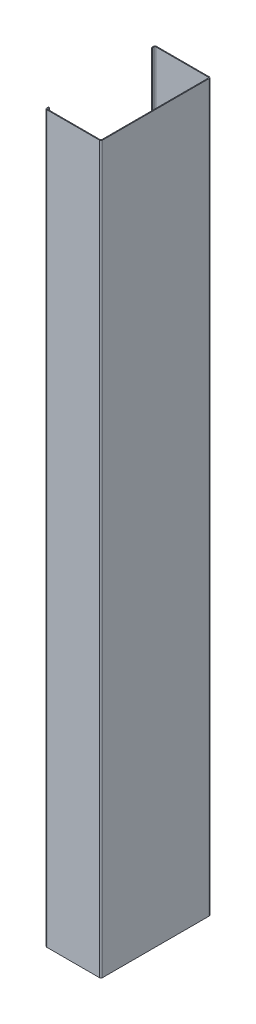
ISO-10303-21;
HEADER;
FILE_DESCRIPTION(('STEP AP214'),'2;1');
FILE_NAME('part.step','',(''),(''),'','','');
FILE_SCHEMA(('AUTOMOTIVE_DESIGN { 1 0 10303 214 1 1 1 1 }'));
ENDSEC;
DATA;
#1=APPLICATION_CONTEXT('core data for automotive mechanical design processes');
#2=APPLICATION_PROTOCOL_DEFINITION('international standard','automotive_design',2000,#1);
#3=PRODUCT_CONTEXT('',#1,'mechanical');
#4=PRODUCT('Part','Part','',(#3));
#5=PRODUCT_RELATED_PRODUCT_CATEGORY('part','',(#4));
#6=PRODUCT_DEFINITION_FORMATION('','',#4);
#7=PRODUCT_DEFINITION_CONTEXT('part definition',#1,'design');
#8=PRODUCT_DEFINITION('design','',#6,#7);
#9=PRODUCT_DEFINITION_SHAPE('','',#8);
#10=(LENGTH_UNIT() NAMED_UNIT(*) SI_UNIT(.MILLI.,.METRE.));
#11=(NAMED_UNIT(*) PLANE_ANGLE_UNIT() SI_UNIT($,.RADIAN.));
#12=(NAMED_UNIT(*) SI_UNIT($,.STERADIAN.) SOLID_ANGLE_UNIT());
#13=UNCERTAINTY_MEASURE_WITH_UNIT(LENGTH_MEASURE(1.E-05),#10,'distance_accuracy_value','');
#14=(GEOMETRIC_REPRESENTATION_CONTEXT(3) GLOBAL_UNCERTAINTY_ASSIGNED_CONTEXT((#13)) GLOBAL_UNIT_ASSIGNED_CONTEXT((#10,
#11,#12)) REPRESENTATION_CONTEXT('',''));
#15=CARTESIAN_POINT('',(0.,0.,0.));
#16=DIRECTION('',(0.,0.,1.));
#17=DIRECTION('',(1.,0.,0.));
#18=AXIS2_PLACEMENT_3D('',#15,#16,#17);
#19=CARTESIAN_POINT('',(-50.,3000.,-49.25));
#20=DIRECTION('',(1.,0.,0.));
#21=DIRECTION('',(0.,0.,-1.));
#22=AXIS2_PLACEMENT_3D('',#19,#20,#21);
#23=PLANE('',#22);
#24=DIRECTION('',(0.,0.,-1.));
#25=VECTOR('',#24,1.);
#26=CARTESIAN_POINT('',(-50.,650.75,49.25));
#27=LINE('',#26,#25);
#28=CARTESIAN_POINT('',(-50.,650.75,-46.25));
#29=VERTEX_POINT('',#28);
#30=CARTESIAN_POINT('',(-50.,650.75,-47.75));
#31=VERTEX_POINT('',#30);
#32=EDGE_CURVE('E183',#29,#31,#27,.T.);
#33=ORIENTED_EDGE('',*,*,#32,.T.);
#34=DIRECTION('',(0.,-1.,0.));
#35=VECTOR('',#34,1.);
#36=CARTESIAN_POINT('',(-50.,3000.,-47.75));
#37=LINE('',#36,#35);
#38=CARTESIAN_POINT('',(-50.,0.,-47.75));
#39=VERTEX_POINT('',#38);
#40=EDGE_CURVE('E58',#31,#39,#37,.T.);
#41=ORIENTED_EDGE('',*,*,#40,.T.);
#42=DIRECTION('',(0.,0.,1.));
#43=VECTOR('',#42,1.);
#44=CARTESIAN_POINT('',(-50.,0.,-49.25));
#45=LINE('',#44,#43);
#46=CARTESIAN_POINT('',(-50.,0.,-46.25));
#47=VERTEX_POINT('',#46);
#48=EDGE_CURVE('E235',#39,#47,#45,.T.);
#49=ORIENTED_EDGE('',*,*,#48,.T.);
#50=DIRECTION('',(0.,-1.,0.));
#51=VECTOR('',#50,1.);
#52=CARTESIAN_POINT('',(-50.,3000.,-46.25));
#53=LINE('',#52,#51);
#54=EDGE_CURVE('E44',#29,#47,#53,.T.);
#55=ORIENTED_EDGE('',*,*,#54,.F.);
#56=EDGE_LOOP('',(#33,#41,#49,#55));
#57=FACE_BOUND('',#56,.T.);
#58=ADVANCED_FACE('F37',(#57),#23,.F.);
#59=CARTESIAN_POINT('',(-49.25,3000.,-46.25));
#60=DIRECTION('',(0.,0.,1.));
#61=DIRECTION('',(1.,0.,0.));
#62=AXIS2_PLACEMENT_3D('',#59,#60,#61);
#63=PLANE('',#62);
#64=DIRECTION('',(0.,-1.,0.));
#65=VECTOR('',#64,1.);
#66=CARTESIAN_POINT('',(-49.25,3000.,-46.25));
#67=LINE('',#66,#65);
#68=CARTESIAN_POINT('',(-49.25,650.75,-46.25));
#69=VERTEX_POINT('',#68);
#70=CARTESIAN_POINT('',(-49.25,0.,-46.25));
#71=VERTEX_POINT('',#70);
#72=EDGE_CURVE('E223',#69,#71,#67,.T.);
#73=ORIENTED_EDGE('',*,*,#72,.F.);
#74=DIRECTION('',(-1.,0.,0.));
#75=VECTOR('',#74,1.);
#76=CARTESIAN_POINT('',(-49.25,650.75,-46.25));
#77=LINE('',#76,#75);
#78=EDGE_CURVE('E233',#69,#29,#77,.T.);
#79=ORIENTED_EDGE('',*,*,#78,.T.);
#80=ORIENTED_EDGE('',*,*,#54,.T.);
#81=DIRECTION('',(-1.,0.,0.));
#82=VECTOR('',#81,1.);
#83=CARTESIAN_POINT('',(-49.25,0.,-46.25));
#84=LINE('',#83,#82);
#85=EDGE_CURVE('E231',#71,#47,#84,.T.);
#86=ORIENTED_EDGE('',*,*,#85,.F.);
#87=EDGE_LOOP('',(#73,#79,#80,#86));
#88=FACE_BOUND('',#87,.T.);
#89=ADVANCED_FACE('F229',(#88),#63,.T.);
#90=CARTESIAN_POINT('',(-49.25,3000.,-49.25));
#91=DIRECTION('',(1.,0.,0.));
#92=DIRECTION('',(0.,0.,-1.));
#93=AXIS2_PLACEMENT_3D('',#90,#91,#92);
#94=PLANE('',#93);
#95=DIRECTION('',(0.,-1.,0.));
#96=VECTOR('',#95,1.);
#97=CARTESIAN_POINT('',(-49.25,3000.,-47.75));
#98=LINE('',#97,#96);
#99=CARTESIAN_POINT('',(-49.25,650.75,-47.75));
#100=VERTEX_POINT('',#99);
#101=CARTESIAN_POINT('',(-49.25,0.,-47.75));
#102=VERTEX_POINT('',#101);
#103=EDGE_CURVE('E221',#100,#102,#98,.T.);
#104=ORIENTED_EDGE('',*,*,#103,.F.);
#105=DIRECTION('',(0.,0.,1.));
#106=VECTOR('',#105,1.);
#107=CARTESIAN_POINT('',(-49.25,650.75,-49.25));
#108=LINE('',#107,#106);
#109=EDGE_CURVE('E351',#100,#69,#108,.T.);
#110=ORIENTED_EDGE('',*,*,#109,.T.);
#111=ORIENTED_EDGE('',*,*,#72,.T.);
#112=DIRECTION('',(0.,0.,-1.));
#113=VECTOR('',#112,1.);
#114=CARTESIAN_POINT('',(-49.25,0.,-49.25));
#115=LINE('',#114,#113);
#116=EDGE_CURVE('E243',#102,#71,#115,.F.);
#117=ORIENTED_EDGE('',*,*,#116,.F.);
#118=EDGE_LOOP('',(#104,#110,#111,#117));
#119=FACE_BOUND('',#118,.T.);
#120=ADVANCED_FACE('F355',(#119),#94,.T.);
#121=CARTESIAN_POINT('',(-48.5,3000.,-47.75));
#122=DIRECTION('',(0.,-1.,0.));
#123=DIRECTION('',(0.,0.,-1.));
#124=AXIS2_PLACEMENT_3D('',#121,#122,#123);
#125=CYLINDRICAL_SURFACE('',#124,0.75);
#126=DIRECTION('',(0.,-1.,0.));
#127=VECTOR('',#126,1.);
#128=CARTESIAN_POINT('',(-48.5,3000.,-48.5));
#129=LINE('',#128,#127);
#130=CARTESIAN_POINT('',(-48.5,650.75,-48.5));
#131=VERTEX_POINT('',#130);
#132=CARTESIAN_POINT('',(-48.5,0.,-48.5));
#133=VERTEX_POINT('',#132);
#134=EDGE_CURVE('E219',#131,#133,#129,.T.);
#135=ORIENTED_EDGE('',*,*,#134,.F.);
#136=CARTESIAN_POINT('',(-48.5,650.75,-47.75));
#137=DIRECTION('',(0.,1.,0.));
#138=DIRECTION('',(0.,0.,1.));
#139=AXIS2_PLACEMENT_3D('',#136,#137,#138);
#140=CIRCLE('',#139,0.75);
#141=EDGE_CURVE('E348',#131,#100,#140,.T.);
#142=ORIENTED_EDGE('',*,*,#141,.T.);
#143=ORIENTED_EDGE('',*,*,#103,.T.);
#144=CARTESIAN_POINT('',(-48.5,0.,-47.75));
#145=DIRECTION('',(0.,1.,0.));
#146=DIRECTION('',(1.,0.,0.));
#147=AXIS2_PLACEMENT_3D('',#144,#145,#146);
#148=CIRCLE('',#147,0.75);
#149=EDGE_CURVE('E245',#133,#102,#148,.T.);
#150=ORIENTED_EDGE('',*,*,#149,.F.);
#151=EDGE_LOOP('',(#135,#142,#143,#150));
#152=FACE_BOUND('',#151,.T.);
#153=ADVANCED_FACE('F358',(#152),#125,.F.);
#154=CARTESIAN_POINT('',(-50.,3000.,-48.5));
#155=DIRECTION('',(0.,0.,1.));
#156=DIRECTION('',(1.,0.,0.));
#157=AXIS2_PLACEMENT_3D('',#154,#155,#156);
#158=PLANE('',#157);
#159=DIRECTION('',(0.,-1.,0.));
#160=VECTOR('',#159,1.);
#161=CARTESIAN_POINT('',(-1.50000000000004,3000.,-48.5));
#162=LINE('',#161,#160);
#163=CARTESIAN_POINT('',(-1.50000000000004,650.75,-48.5));
#164=VERTEX_POINT('',#163);
#165=CARTESIAN_POINT('',(-1.50000000000004,0.,-48.5));
#166=VERTEX_POINT('',#165);
#167=EDGE_CURVE('E217',#164,#166,#162,.T.);
#168=ORIENTED_EDGE('',*,*,#167,.F.);
#169=DIRECTION('',(-1.,0.,0.));
#170=VECTOR('',#169,1.);
#171=CARTESIAN_POINT('',(-50.,650.75,-48.5));
#172=LINE('',#171,#170);
#173=EDGE_CURVE('E345',#164,#131,#172,.T.);
#174=ORIENTED_EDGE('',*,*,#173,.T.);
#175=ORIENTED_EDGE('',*,*,#134,.T.);
#176=DIRECTION('',(1.,0.,0.));
#177=VECTOR('',#176,1.);
#178=CARTESIAN_POINT('',(-50.,0.,-48.5));
#179=LINE('',#178,#177);
#180=EDGE_CURVE('E250',#166,#133,#179,.F.);
#181=ORIENTED_EDGE('',*,*,#180,.F.);
#182=EDGE_LOOP('',(#168,#174,#175,#181));
#183=FACE_BOUND('',#182,.T.);
#184=ADVANCED_FACE('F363',(#183),#158,.T.);
#185=CARTESIAN_POINT('',(-1.50000000000004,3000.,-47.75));
#186=DIRECTION('',(0.,-1.,0.));
#187=DIRECTION('',(0.,0.,-1.));
#188=AXIS2_PLACEMENT_3D('',#185,#186,#187);
#189=CYLINDRICAL_SURFACE('',#188,0.75);
#190=DIRECTION('',(0.,-1.,0.));
#191=VECTOR('',#190,1.);
#192=CARTESIAN_POINT('',(-0.750000000000037,3000.,-47.75));
#193=LINE('',#192,#191);
#194=CARTESIAN_POINT('',(-0.750000000000037,650.75,-47.75));
#195=VERTEX_POINT('',#194);
#196=CARTESIAN_POINT('',(-0.750000000000037,0.,-47.75));
#197=VERTEX_POINT('',#196);
#198=EDGE_CURVE('E215',#195,#197,#193,.T.);
#199=ORIENTED_EDGE('',*,*,#198,.F.);
#200=CARTESIAN_POINT('',(-1.50000000000004,650.75,-47.75));
#201=DIRECTION('',(0.,1.,0.));
#202=DIRECTION('',(0.,0.,1.));
#203=AXIS2_PLACEMENT_3D('',#200,#201,#202);
#204=CIRCLE('',#203,0.75);
#205=EDGE_CURVE('E342',#195,#164,#204,.T.);
#206=ORIENTED_EDGE('',*,*,#205,.T.);
#207=ORIENTED_EDGE('',*,*,#167,.T.);
#208=CARTESIAN_POINT('',(-1.50000000000004,0.,-47.75));
#209=DIRECTION('',(0.,1.,0.));
#210=DIRECTION('',(1.,0.,0.));
#211=AXIS2_PLACEMENT_3D('',#208,#209,#210);
#212=CIRCLE('',#211,0.75);
#213=EDGE_CURVE('E253',#197,#166,#212,.T.);
#214=ORIENTED_EDGE('',*,*,#213,.F.);
#215=EDGE_LOOP('',(#199,#206,#207,#214));
#216=FACE_BOUND('',#215,.T.);
#217=ADVANCED_FACE('F366',(#216),#189,.F.);
#218=CARTESIAN_POINT('',(-0.750000000000038,3000.,-49.25));
#219=DIRECTION('',(-1.,0.,0.));
#220=DIRECTION('',(0.,0.,1.));
#221=AXIS2_PLACEMENT_3D('',#218,#219,#220);
#222=PLANE('',#221);
#223=DIRECTION('',(0.,-1.,0.));
#224=VECTOR('',#223,1.);
#225=CARTESIAN_POINT('',(-0.749999999999984,3000.,47.75));
#226=LINE('',#225,#224);
#227=CARTESIAN_POINT('',(-0.749999999999984,650.75,47.75));
#228=VERTEX_POINT('',#227);
#229=CARTESIAN_POINT('',(-0.749999999999984,0.,47.75));
#230=VERTEX_POINT('',#229);
#231=EDGE_CURVE('E213',#228,#230,#226,.T.);
#232=ORIENTED_EDGE('',*,*,#231,.F.);
#233=DIRECTION('',(0.,0.,-1.));
#234=VECTOR('',#233,1.);
#235=CARTESIAN_POINT('',(-0.750000000000038,650.75,-49.25));
#236=LINE('',#235,#234);
#237=EDGE_CURVE('E339',#228,#195,#236,.T.);
#238=ORIENTED_EDGE('',*,*,#237,.T.);
#239=ORIENTED_EDGE('',*,*,#198,.T.);
#240=DIRECTION('',(0.,0.,-1.));
#241=VECTOR('',#240,1.);
#242=CARTESIAN_POINT('',(-0.750000000000038,0.,-49.25));
#243=LINE('',#242,#241);
#244=EDGE_CURVE('E256',#230,#197,#243,.T.);
#245=ORIENTED_EDGE('',*,*,#244,.F.);
#246=EDGE_LOOP('',(#232,#238,#239,#245));
#247=FACE_BOUND('',#246,.T.);
#248=ADVANCED_FACE('F371',(#247),#222,.T.);
#249=CARTESIAN_POINT('',(-1.49999999999998,3000.,47.75));
#250=DIRECTION('',(0.,-1.,0.));
#251=DIRECTION('',(0.,0.,-1.));
#252=AXIS2_PLACEMENT_3D('',#249,#250,#251);
#253=CYLINDRICAL_SURFACE('',#252,0.75);
#254=DIRECTION('',(0.,-1.,0.));
#255=VECTOR('',#254,1.);
#256=CARTESIAN_POINT('',(-1.49999999999998,3000.,48.5));
#257=LINE('',#256,#255);
#258=CARTESIAN_POINT('',(-1.49999999999998,650.75,48.5));
#259=VERTEX_POINT('',#258);
#260=CARTESIAN_POINT('',(-1.49999999999998,0.,48.5));
#261=VERTEX_POINT('',#260);
#262=EDGE_CURVE('E211',#259,#261,#257,.T.);
#263=ORIENTED_EDGE('',*,*,#262,.F.);
#264=CARTESIAN_POINT('',(-1.49999999999998,650.75,47.75));
#265=DIRECTION('',(0.,1.,0.));
#266=DIRECTION('',(0.,0.,1.));
#267=AXIS2_PLACEMENT_3D('',#264,#265,#266);
#268=CIRCLE('',#267,0.75);
#269=EDGE_CURVE('E336',#259,#228,#268,.T.);
#270=ORIENTED_EDGE('',*,*,#269,.T.);
#271=ORIENTED_EDGE('',*,*,#231,.T.);
#272=CARTESIAN_POINT('',(-1.49999999999998,0.,47.75));
#273=DIRECTION('',(0.,1.,0.));
#274=DIRECTION('',(1.,0.,0.));
#275=AXIS2_PLACEMENT_3D('',#272,#273,#274);
#276=CIRCLE('',#275,0.75);
#277=EDGE_CURVE('E259',#261,#230,#276,.T.);
#278=ORIENTED_EDGE('',*,*,#277,.F.);
#279=EDGE_LOOP('',(#263,#270,#271,#278));
#280=FACE_BOUND('',#279,.T.);
#281=ADVANCED_FACE('F374',(#280),#253,.F.);
#282=CARTESIAN_POINT('',(0.,3000.,48.5));
#283=DIRECTION('',(0.,0.,-1.));
#284=DIRECTION('',(-1.,0.,0.));
#285=AXIS2_PLACEMENT_3D('',#282,#283,#284);
#286=PLANE('',#285);
#287=DIRECTION('',(0.,-1.,0.));
#288=VECTOR('',#287,1.);
#289=CARTESIAN_POINT('',(-48.5,3000.,48.5));
#290=LINE('',#289,#288);
#291=CARTESIAN_POINT('',(-48.5,650.75,48.5));
#292=VERTEX_POINT('',#291);
#293=CARTESIAN_POINT('',(-48.5,0.,48.5));
#294=VERTEX_POINT('',#293);
#295=EDGE_CURVE('E209',#292,#294,#290,.T.);
#296=ORIENTED_EDGE('',*,*,#295,.F.);
#297=DIRECTION('',(1.,0.,0.));
#298=VECTOR('',#297,1.);
#299=CARTESIAN_POINT('',(0.,650.75,48.5));
#300=LINE('',#299,#298);
#301=EDGE_CURVE('E333',#292,#259,#300,.T.);
#302=ORIENTED_EDGE('',*,*,#301,.T.);
#303=ORIENTED_EDGE('',*,*,#262,.T.);
#304=DIRECTION('',(1.,0.,0.));
#305=VECTOR('',#304,1.);
#306=CARTESIAN_POINT('',(0.,0.,48.5));
#307=LINE('',#306,#305);
#308=EDGE_CURVE('E262',#294,#261,#307,.T.);
#309=ORIENTED_EDGE('',*,*,#308,.F.);
#310=EDGE_LOOP('',(#296,#302,#303,#309));
#311=FACE_BOUND('',#310,.T.);
#312=ADVANCED_FACE('F379',(#311),#286,.T.);
#313=CARTESIAN_POINT('',(-48.5,3000.,47.75));
#314=DIRECTION('',(0.,-1.,0.));
#315=DIRECTION('',(0.,0.,-1.));
#316=AXIS2_PLACEMENT_3D('',#313,#314,#315);
#317=CYLINDRICAL_SURFACE('',#316,0.75);
#318=DIRECTION('',(0.,-1.,0.));
#319=VECTOR('',#318,1.);
#320=CARTESIAN_POINT('',(-49.25,3000.,47.75));
#321=LINE('',#320,#319);
#322=CARTESIAN_POINT('',(-49.25,650.75,47.75));
#323=VERTEX_POINT('',#322);
#324=CARTESIAN_POINT('',(-49.25,0.,47.75));
#325=VERTEX_POINT('',#324);
#326=EDGE_CURVE('E207',#323,#325,#321,.T.);
#327=ORIENTED_EDGE('',*,*,#326,.F.);
#328=CARTESIAN_POINT('',(-48.5,650.75,47.75));
#329=DIRECTION('',(0.,1.,0.));
#330=DIRECTION('',(0.,0.,1.));
#331=AXIS2_PLACEMENT_3D('',#328,#329,#330);
#332=CIRCLE('',#331,0.75);
#333=EDGE_CURVE('E330',#323,#292,#332,.T.);
#334=ORIENTED_EDGE('',*,*,#333,.T.);
#335=ORIENTED_EDGE('',*,*,#295,.T.);
#336=CARTESIAN_POINT('',(-48.5,0.,47.75));
#337=DIRECTION('',(0.,1.,0.));
#338=DIRECTION('',(1.,0.,0.));
#339=AXIS2_PLACEMENT_3D('',#336,#337,#338);
#340=CIRCLE('',#339,0.75);
#341=EDGE_CURVE('E265',#325,#294,#340,.T.);
#342=ORIENTED_EDGE('',*,*,#341,.F.);
#343=EDGE_LOOP('',(#327,#334,#335,#342));
#344=FACE_BOUND('',#343,.T.);
#345=ADVANCED_FACE('F382',(#344),#317,.F.);
#346=CARTESIAN_POINT('',(-49.25,3000.,49.25));
#347=DIRECTION('',(1.,0.,0.));
#348=DIRECTION('',(0.,0.,-1.));
#349=AXIS2_PLACEMENT_3D('',#346,#347,#348);
#350=PLANE('',#349);
#351=DIRECTION('',(0.,-1.,0.));
#352=VECTOR('',#351,1.);
#353=CARTESIAN_POINT('',(-49.25,3000.,46.25));
#354=LINE('',#353,#352);
#355=CARTESIAN_POINT('',(-49.25,650.75,46.25));
#356=VERTEX_POINT('',#355);
#357=CARTESIAN_POINT('',(-49.25,0.,46.25));
#358=VERTEX_POINT('',#357);
#359=EDGE_CURVE('E200',#356,#358,#354,.T.);
#360=ORIENTED_EDGE('',*,*,#359,.F.);
#361=DIRECTION('',(0.,0.,1.));
#362=VECTOR('',#361,1.);
#363=CARTESIAN_POINT('',(-49.25,650.75,49.25));
#364=LINE('',#363,#362);
#365=EDGE_CURVE('E327',#356,#323,#364,.T.);
#366=ORIENTED_EDGE('',*,*,#365,.T.);
#367=ORIENTED_EDGE('',*,*,#326,.T.);
#368=DIRECTION('',(0.,0.,-1.));
#369=VECTOR('',#368,1.);
#370=CARTESIAN_POINT('',(-49.25,0.,49.25));
#371=LINE('',#370,#369);
#372=EDGE_CURVE('E268',#358,#325,#371,.F.);
#373=ORIENTED_EDGE('',*,*,#372,.F.);
#374=EDGE_LOOP('',(#360,#366,#367,#373));
#375=FACE_BOUND('',#374,.T.);
#376=ADVANCED_FACE('F387',(#375),#350,.T.);
#377=CARTESIAN_POINT('',(-50.,3000.,46.25));
#378=DIRECTION('',(0.,0.,-1.));
#379=DIRECTION('',(-1.,0.,0.));
#380=AXIS2_PLACEMENT_3D('',#377,#378,#379);
#381=PLANE('',#380);
#382=DIRECTION('',(0.,-1.,0.));
#383=VECTOR('',#382,1.);
#384=CARTESIAN_POINT('',(-50.,3000.,46.25));
#385=LINE('',#384,#383);
#386=CARTESIAN_POINT('',(-50.,650.75,46.25));
#387=VERTEX_POINT('',#386);
#388=CARTESIAN_POINT('',(-50.,0.,46.25));
#389=VERTEX_POINT('',#388);
#390=EDGE_CURVE('E198',#387,#389,#385,.T.);
#391=ORIENTED_EDGE('',*,*,#390,.F.);
#392=DIRECTION('',(1.,0.,0.));
#393=VECTOR('',#392,1.);
#394=CARTESIAN_POINT('',(-50.,650.75,46.25));
#395=LINE('',#394,#393);
#396=EDGE_CURVE('E178',#387,#356,#395,.T.);
#397=ORIENTED_EDGE('',*,*,#396,.T.);
#398=ORIENTED_EDGE('',*,*,#359,.T.);
#399=DIRECTION('',(1.,0.,0.));
#400=VECTOR('',#399,1.);
#401=CARTESIAN_POINT('',(-50.,0.,46.25));
#402=LINE('',#401,#400);
#403=EDGE_CURVE('E270',#389,#358,#402,.T.);
#404=ORIENTED_EDGE('',*,*,#403,.F.);
#405=EDGE_LOOP('',(#391,#397,#398,#404));
#406=FACE_BOUND('',#405,.T.);
#407=ADVANCED_FACE('F389',(#406),#381,.T.);
#408=CARTESIAN_POINT('',(-50.,3000.,49.25));
#409=DIRECTION('',(1.,0.,0.));
#410=DIRECTION('',(0.,0.,-1.));
#411=AXIS2_PLACEMENT_3D('',#408,#409,#410);
#412=PLANE('',#411);
#413=CARTESIAN_POINT('',(-50.,650.75,47.75));
#414=VERTEX_POINT('',#413);
#415=EDGE_CURVE('E172',#414,#387,#27,.T.);
#416=ORIENTED_EDGE('',*,*,#415,.T.);
#417=ORIENTED_EDGE('',*,*,#390,.T.);
#418=DIRECTION('',(0.,0.,1.));
#419=VECTOR('',#418,1.);
#420=CARTESIAN_POINT('',(-50.,0.,49.25));
#421=LINE('',#420,#419);
#422=CARTESIAN_POINT('',(-50.,0.,47.75));
#423=VERTEX_POINT('',#422);
#424=EDGE_CURVE('E196',#389,#423,#421,.T.);
#425=ORIENTED_EDGE('',*,*,#424,.T.);
#426=DIRECTION('',(0.,-1.,0.));
#427=VECTOR('',#426,1.);
#428=CARTESIAN_POINT('',(-50.,3000.,47.75));
#429=LINE('',#428,#427);
#430=EDGE_CURVE('E189',#414,#423,#429,.T.);
#431=ORIENTED_EDGE('',*,*,#430,.F.);
#432=EDGE_LOOP('',(#416,#417,#425,#431));
#433=FACE_BOUND('',#432,.T.);
#434=ADVANCED_FACE('F194',(#433),#412,.F.);
#435=CARTESIAN_POINT('',(-48.5,3000.,47.75));
#436=DIRECTION('',(0.,-1.,0.));
#437=DIRECTION('',(0.,0.,-1.));
#438=AXIS2_PLACEMENT_3D('',#435,#436,#437);
#439=CYLINDRICAL_SURFACE('',#438,1.5);
#440=CARTESIAN_POINT('',(-48.5,650.75,47.75));
#441=DIRECTION('',(0.,1.,0.));
#442=DIRECTION('',(0.,0.,1.));
#443=AXIS2_PLACEMENT_3D('',#440,#441,#442);
#444=CIRCLE('',#443,1.5);
#445=CARTESIAN_POINT('',(-48.5,650.75,49.25));
#446=VERTEX_POINT('',#445);
#447=EDGE_CURVE('E175',#414,#446,#444,.T.);
#448=ORIENTED_EDGE('',*,*,#447,.F.);
#449=ORIENTED_EDGE('',*,*,#430,.T.);
#450=CARTESIAN_POINT('',(-48.5,0.,47.75));
#451=DIRECTION('',(0.,-1.,0.));
#452=DIRECTION('',(0.,0.,-1.));
#453=AXIS2_PLACEMENT_3D('',#450,#451,#452);
#454=CIRCLE('',#453,1.5);
#455=CARTESIAN_POINT('',(-48.5,0.,49.25));
#456=VERTEX_POINT('',#455);
#457=EDGE_CURVE('E274',#423,#456,#454,.F.);
#458=ORIENTED_EDGE('',*,*,#457,.T.);
#459=DIRECTION('',(0.,-1.,0.));
#460=VECTOR('',#459,1.);
#461=CARTESIAN_POINT('',(-48.5,3000.,49.25));
#462=LINE('',#461,#460);
#463=EDGE_CURVE('E191',#446,#456,#462,.T.);
#464=ORIENTED_EDGE('',*,*,#463,.F.);
#465=EDGE_LOOP('',(#448,#449,#458,#464));
#466=FACE_BOUND('',#465,.T.);
#467=ADVANCED_FACE('F187',(#466),#439,.T.);
#468=CARTESIAN_POINT('',(0.,3000.,49.25));
#469=DIRECTION('',(0.,0.,-1.));
#470=DIRECTION('',(-1.,0.,0.));
#471=AXIS2_PLACEMENT_3D('',#468,#469,#470);
#472=PLANE('',#471);
#473=DIRECTION('',(1.,0.,0.));
#474=VECTOR('',#473,1.);
#475=CARTESIAN_POINT('',(0.,650.75,49.25));
#476=LINE('',#475,#474);
#477=CARTESIAN_POINT('',(-1.49999999999998,650.75,49.25));
#478=VERTEX_POINT('',#477);
#479=EDGE_CURVE('E323',#446,#478,#476,.T.);
#480=ORIENTED_EDGE('',*,*,#479,.F.);
#481=ORIENTED_EDGE('',*,*,#463,.T.);
#482=DIRECTION('',(1.,0.,0.));
#483=VECTOR('',#482,1.);
#484=CARTESIAN_POINT('',(0.,0.,49.25));
#485=LINE('',#484,#483);
#486=CARTESIAN_POINT('',(-1.49999999999998,0.,49.25));
#487=VERTEX_POINT('',#486);
#488=EDGE_CURVE('E276',#456,#487,#485,.T.);
#489=ORIENTED_EDGE('',*,*,#488,.T.);
#490=DIRECTION('',(0.,-1.,0.));
#491=VECTOR('',#490,1.);
#492=CARTESIAN_POINT('',(-1.49999999999998,3000.,49.25));
#493=LINE('',#492,#491);
#494=EDGE_CURVE('E202',#478,#487,#493,.T.);
#495=ORIENTED_EDGE('',*,*,#494,.F.);
#496=EDGE_LOOP('',(#480,#481,#489,#495));
#497=FACE_BOUND('',#496,.T.);
#498=ADVANCED_FACE('F310',(#497),#472,.F.);
#499=CARTESIAN_POINT('',(-1.49999999999998,3000.,47.75));
#500=DIRECTION('',(0.,-1.,0.));
#501=DIRECTION('',(0.,0.,-1.));
#502=AXIS2_PLACEMENT_3D('',#499,#500,#501);
#503=CYLINDRICAL_SURFACE('',#502,1.5);
#504=CARTESIAN_POINT('',(-1.49999999999998,650.75,47.75));
#505=DIRECTION('',(0.,1.,0.));
#506=DIRECTION('',(0.,0.,1.));
#507=AXIS2_PLACEMENT_3D('',#504,#505,#506);
#508=CIRCLE('',#507,1.5);
#509=CARTESIAN_POINT('',(0.,650.75,47.75));
#510=VERTEX_POINT('',#509);
#511=EDGE_CURVE('E192',#478,#510,#508,.T.);
#512=ORIENTED_EDGE('',*,*,#511,.F.);
#513=ORIENTED_EDGE('',*,*,#494,.T.);
#514=CARTESIAN_POINT('',(-1.49999999999998,0.,47.75));
#515=DIRECTION('',(0.,-1.,0.));
#516=DIRECTION('',(0.,0.,-1.));
#517=AXIS2_PLACEMENT_3D('',#514,#515,#516);
#518=CIRCLE('',#517,1.5);
#519=CARTESIAN_POINT('',(0.,0.,47.75));
#520=VERTEX_POINT('',#519);
#521=EDGE_CURVE('E279',#487,#520,#518,.F.);
#522=ORIENTED_EDGE('',*,*,#521,.T.);
#523=DIRECTION('',(0.,-1.,0.));
#524=VECTOR('',#523,1.);
#525=CARTESIAN_POINT('',(0.,3000.,47.75));
#526=LINE('',#525,#524);
#527=EDGE_CURVE('E300',#510,#520,#526,.T.);
#528=ORIENTED_EDGE('',*,*,#527,.F.);
#529=EDGE_LOOP('',(#512,#513,#522,#528));
#530=FACE_BOUND('',#529,.T.);
#531=ADVANCED_FACE('F304',(#530),#503,.T.);
#532=CARTESIAN_POINT('',(0.,3000.,-49.25));
#533=DIRECTION('',(-1.,0.,0.));
#534=DIRECTION('',(0.,0.,1.));
#535=AXIS2_PLACEMENT_3D('',#532,#533,#534);
#536=PLANE('',#535);
#537=DIRECTION('',(0.,0.,-1.));
#538=VECTOR('',#537,1.);
#539=CARTESIAN_POINT('',(0.,650.75,49.25));
#540=LINE('',#539,#538);
#541=CARTESIAN_POINT('',(0.,650.75,-47.75));
#542=VERTEX_POINT('',#541);
#543=EDGE_CURVE('E182',#510,#542,#540,.T.);
#544=ORIENTED_EDGE('',*,*,#543,.F.);
#545=ORIENTED_EDGE('',*,*,#527,.T.);
#546=DIRECTION('',(0.,0.,-1.));
#547=VECTOR('',#546,1.);
#548=CARTESIAN_POINT('',(0.,0.,-49.25));
#549=LINE('',#548,#547);
#550=CARTESIAN_POINT('',(0.,0.,-47.75));
#551=VERTEX_POINT('',#550);
#552=EDGE_CURVE('E282',#520,#551,#549,.T.);
#553=ORIENTED_EDGE('',*,*,#552,.T.);
#554=DIRECTION('',(0.,-1.,0.));
#555=VECTOR('',#554,1.);
#556=CARTESIAN_POINT('',(0.,3000.,-47.75));
#557=LINE('',#556,#555);
#558=EDGE_CURVE('E298',#542,#551,#557,.T.);
#559=ORIENTED_EDGE('',*,*,#558,.F.);
#560=EDGE_LOOP('',(#544,#545,#553,#559));
#561=FACE_BOUND('',#560,.T.);
#562=ADVANCED_FACE('F316',(#561),#536,.F.);
#563=CARTESIAN_POINT('',(-1.50000000000004,3000.,-47.75));
#564=DIRECTION('',(0.,-1.,0.));
#565=DIRECTION('',(0.,0.,-1.));
#566=AXIS2_PLACEMENT_3D('',#563,#564,#565);
#567=CYLINDRICAL_SURFACE('',#566,1.5);
#568=CARTESIAN_POINT('',(-1.50000000000004,650.75,-47.75));
#569=DIRECTION('',(0.,1.,0.));
#570=DIRECTION('',(0.,0.,1.));
#571=AXIS2_PLACEMENT_3D('',#568,#569,#570);
#572=CIRCLE('',#571,1.5);
#573=CARTESIAN_POINT('',(-1.50000000000004,650.75,-49.25));
#574=VERTEX_POINT('',#573);
#575=EDGE_CURVE('E318',#542,#574,#572,.T.);
#576=ORIENTED_EDGE('',*,*,#575,.F.);
#577=ORIENTED_EDGE('',*,*,#558,.T.);
#578=CARTESIAN_POINT('',(-1.50000000000004,0.,-47.75));
#579=DIRECTION('',(0.,-1.,0.));
#580=DIRECTION('',(0.,0.,-1.));
#581=AXIS2_PLACEMENT_3D('',#578,#579,#580);
#582=CIRCLE('',#581,1.5);
#583=CARTESIAN_POINT('',(-1.50000000000004,0.,-49.25));
#584=VERTEX_POINT('',#583);
#585=EDGE_CURVE('E285',#551,#584,#582,.F.);
#586=ORIENTED_EDGE('',*,*,#585,.T.);
#587=DIRECTION('',(0.,-1.,0.));
#588=VECTOR('',#587,1.);
#589=CARTESIAN_POINT('',(-1.50000000000004,3000.,-49.25));
#590=LINE('',#589,#588);
#591=EDGE_CURVE('E296',#574,#584,#590,.T.);
#592=ORIENTED_EDGE('',*,*,#591,.F.);
#593=EDGE_LOOP('',(#576,#577,#586,#592));
#594=FACE_BOUND('',#593,.T.);
#595=ADVANCED_FACE('F472',(#594),#567,.T.);
#596=CARTESIAN_POINT('',(-50.,3000.,-49.25));
#597=DIRECTION('',(0.,0.,1.));
#598=DIRECTION('',(1.,0.,0.));
#599=AXIS2_PLACEMENT_3D('',#596,#597,#598);
#600=PLANE('',#599);
#601=DIRECTION('',(1.,0.,0.));
#602=VECTOR('',#601,1.);
#603=CARTESIAN_POINT('',(0.,650.75,-49.25));
#604=LINE('',#603,#602);
#605=CARTESIAN_POINT('',(-48.5,650.75,-49.25));
#606=VERTEX_POINT('',#605);
#607=EDGE_CURVE('E50',#606,#574,#604,.T.);
#608=ORIENTED_EDGE('',*,*,#607,.T.);
#609=ORIENTED_EDGE('',*,*,#591,.T.);
#610=DIRECTION('',(-1.,0.,0.));
#611=VECTOR('',#610,1.);
#612=CARTESIAN_POINT('',(-50.,0.,-49.25));
#613=LINE('',#612,#611);
#614=CARTESIAN_POINT('',(-48.5,0.,-49.25));
#615=VERTEX_POINT('',#614);
#616=EDGE_CURVE('E288',#584,#615,#613,.T.);
#617=ORIENTED_EDGE('',*,*,#616,.T.);
#618=DIRECTION('',(0.,-1.,0.));
#619=VECTOR('',#618,1.);
#620=CARTESIAN_POINT('',(-48.5,3000.,-49.25));
#621=LINE('',#620,#619);
#622=EDGE_CURVE('E294',#606,#615,#621,.T.);
#623=ORIENTED_EDGE('',*,*,#622,.F.);
#624=EDGE_LOOP('',(#608,#609,#617,#623));
#625=FACE_BOUND('',#624,.T.);
#626=ADVANCED_FACE('F481',(#625),#600,.F.);
#627=CARTESIAN_POINT('',(-48.5,3000.,-47.75));
#628=DIRECTION('',(0.,-1.,0.));
#629=DIRECTION('',(0.,0.,-1.));
#630=AXIS2_PLACEMENT_3D('',#627,#628,#629);
#631=CYLINDRICAL_SURFACE('',#630,1.5);
#632=CARTESIAN_POINT('',(-48.5,650.75,-47.75));
#633=DIRECTION('',(0.,1.,0.));
#634=DIRECTION('',(0.,0.,1.));
#635=AXIS2_PLACEMENT_3D('',#632,#633,#634);
#636=CIRCLE('',#635,1.5);
#637=EDGE_CURVE('E12',#606,#31,#636,.T.);
#638=ORIENTED_EDGE('',*,*,#637,.F.);
#639=ORIENTED_EDGE('',*,*,#622,.T.);
#640=CARTESIAN_POINT('',(-48.5,0.,-47.75));
#641=DIRECTION('',(0.,-1.,0.));
#642=DIRECTION('',(0.,0.,-1.));
#643=AXIS2_PLACEMENT_3D('',#640,#641,#642);
#644=CIRCLE('',#643,1.5);
#645=EDGE_CURVE('E291',#615,#39,#644,.F.);
#646=ORIENTED_EDGE('',*,*,#645,.T.);
#647=ORIENTED_EDGE('',*,*,#40,.F.);
#648=EDGE_LOOP('',(#638,#639,#646,#647));
#649=FACE_BOUND('',#648,.T.);
#650=ADVANCED_FACE('F491',(#649),#631,.T.);
#651=CARTESIAN_POINT('',(-48.5,0.,-47.75));
#652=DIRECTION('',(0.,1.,0.));
#653=DIRECTION('',(1.,0.,0.));
#654=AXIS2_PLACEMENT_3D('',#651,#652,#653);
#655=PLANE('',#654);
#656=ORIENTED_EDGE('',*,*,#372,.T.);
#657=ORIENTED_EDGE('',*,*,#341,.T.);
#658=ORIENTED_EDGE('',*,*,#308,.T.);
#659=ORIENTED_EDGE('',*,*,#277,.T.);
#660=ORIENTED_EDGE('',*,*,#244,.T.);
#661=ORIENTED_EDGE('',*,*,#213,.T.);
#662=ORIENTED_EDGE('',*,*,#180,.T.);
#663=ORIENTED_EDGE('',*,*,#149,.T.);
#664=ORIENTED_EDGE('',*,*,#116,.T.);
#665=ORIENTED_EDGE('',*,*,#85,.T.);
#666=ORIENTED_EDGE('',*,*,#48,.F.);
#667=ORIENTED_EDGE('',*,*,#645,.F.);
#668=ORIENTED_EDGE('',*,*,#616,.F.);
#669=ORIENTED_EDGE('',*,*,#585,.F.);
#670=ORIENTED_EDGE('',*,*,#552,.F.);
#671=ORIENTED_EDGE('',*,*,#521,.F.);
#672=ORIENTED_EDGE('',*,*,#488,.F.);
#673=ORIENTED_EDGE('',*,*,#457,.F.);
#674=ORIENTED_EDGE('',*,*,#424,.F.);
#675=ORIENTED_EDGE('',*,*,#403,.T.);
#676=EDGE_LOOP('',(#656,#657,#658,#659,#660,#661,#662,#663,#664,#665,#666,#667,#668,#669,#670,
#671,#672,#673,#674,#675));
#677=FACE_BOUND('',#676,.T.);
#678=ADVANCED_FACE('F240',(#677),#655,.F.);
#679=CARTESIAN_POINT('',(0.,650.75,49.25));
#680=DIRECTION('',(0.,1.,0.));
#681=DIRECTION('',(0.,0.,1.));
#682=AXIS2_PLACEMENT_3D('',#679,#680,#681);
#683=PLANE('',#682);
#684=ORIENTED_EDGE('',*,*,#109,.F.);
#685=ORIENTED_EDGE('',*,*,#141,.F.);
#686=ORIENTED_EDGE('',*,*,#173,.F.);
#687=ORIENTED_EDGE('',*,*,#205,.F.);
#688=ORIENTED_EDGE('',*,*,#237,.F.);
#689=ORIENTED_EDGE('',*,*,#269,.F.);
#690=ORIENTED_EDGE('',*,*,#301,.F.);
#691=ORIENTED_EDGE('',*,*,#333,.F.);
#692=ORIENTED_EDGE('',*,*,#365,.F.);
#693=ORIENTED_EDGE('',*,*,#396,.F.);
#694=ORIENTED_EDGE('',*,*,#415,.F.);
#695=ORIENTED_EDGE('',*,*,#447,.T.);
#696=ORIENTED_EDGE('',*,*,#479,.T.);
#697=ORIENTED_EDGE('',*,*,#511,.T.);
#698=ORIENTED_EDGE('',*,*,#543,.T.);
#699=ORIENTED_EDGE('',*,*,#575,.T.);
#700=ORIENTED_EDGE('',*,*,#607,.F.);
#701=ORIENTED_EDGE('',*,*,#637,.T.);
#702=ORIENTED_EDGE('',*,*,#32,.F.);
#703=ORIENTED_EDGE('',*,*,#78,.F.);
#704=EDGE_LOOP('',(#684,#685,#686,#687,#688,#689,#690,#691,#692,#693,#694,#695,#696,#697,#698,
#699,#700,#701,#702,#703));
#705=FACE_BOUND('',#704,.T.);
#706=ADVANCED_FACE('F174',(#705),#683,.T.);
#707=CLOSED_SHELL('',(#58,#89,#120,#153,#184,#217,#248,#281,#312,#345,#376,#407,#434,#467,#498,
#531,#562,#595,#626,#650,#678,#706));
#708=MANIFOLD_SOLID_BREP('B2',#707);
#709=ADVANCED_BREP_SHAPE_REPRESENTATION('',(#18,#708),#14);
#710=SHAPE_DEFINITION_REPRESENTATION(#9,#709);
ENDSEC;
END-ISO-10303-21;
